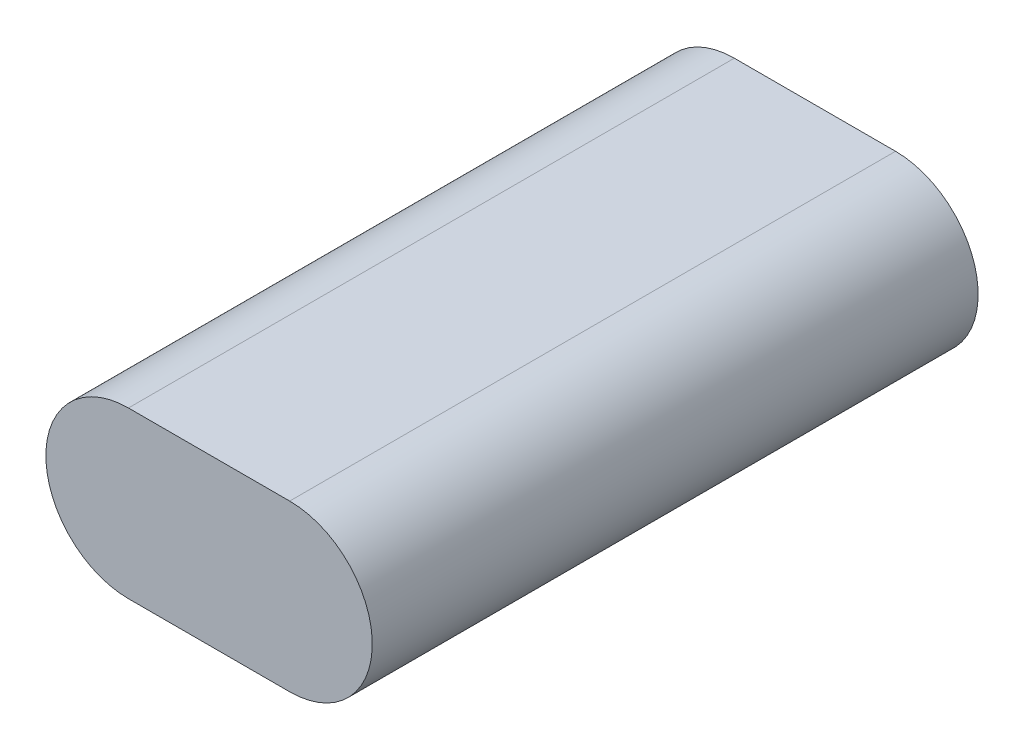
ISO-10303-21;
HEADER;
FILE_DESCRIPTION(('STEP AP214'),'2;1');
FILE_NAME('part.step','',(''),(''),'','','');
FILE_SCHEMA(('AUTOMOTIVE_DESIGN { 1 0 10303 214 1 1 1 1 }'));
ENDSEC;
DATA;
#1=APPLICATION_CONTEXT('core data for automotive mechanical design processes');
#2=APPLICATION_PROTOCOL_DEFINITION('international standard','automotive_design',2000,#1);
#3=PRODUCT_CONTEXT('',#1,'mechanical');
#4=PRODUCT('Part','Part','',(#3));
#5=PRODUCT_RELATED_PRODUCT_CATEGORY('part','',(#4));
#6=PRODUCT_DEFINITION_FORMATION('','',#4);
#7=PRODUCT_DEFINITION_CONTEXT('part definition',#1,'design');
#8=PRODUCT_DEFINITION('design','',#6,#7);
#9=PRODUCT_DEFINITION_SHAPE('','',#8);
#10=(LENGTH_UNIT() NAMED_UNIT(*) SI_UNIT(.MILLI.,.METRE.));
#11=(NAMED_UNIT(*) PLANE_ANGLE_UNIT() SI_UNIT($,.RADIAN.));
#12=(NAMED_UNIT(*) SI_UNIT($,.STERADIAN.) SOLID_ANGLE_UNIT());
#13=UNCERTAINTY_MEASURE_WITH_UNIT(LENGTH_MEASURE(1.E-05),#10,'distance_accuracy_value','');
#14=(GEOMETRIC_REPRESENTATION_CONTEXT(3) GLOBAL_UNCERTAINTY_ASSIGNED_CONTEXT((#13)) GLOBAL_UNIT_ASSIGNED_CONTEXT((#10,
#11,#12)) REPRESENTATION_CONTEXT('',''));
#15=CARTESIAN_POINT('',(0.,0.,0.));
#16=DIRECTION('',(0.,0.,1.));
#17=DIRECTION('',(1.,0.,0.));
#18=AXIS2_PLACEMENT_3D('',#15,#16,#17);
#19=CARTESIAN_POINT('',(16.3,0.,-122.5));
#20=DIRECTION('',(0.,0.,1.));
#21=DIRECTION('',(1.,0.,0.));
#22=AXIS2_PLACEMENT_3D('',#19,#20,#21);
#23=CYLINDRICAL_SURFACE('',#22,16.7);
#24=CARTESIAN_POINT('',(16.3,0.,0.));
#25=DIRECTION('',(0.,0.,1.));
#26=DIRECTION('',(-1.,0.,0.));
#27=AXIS2_PLACEMENT_3D('',#24,#25,#26);
#28=CIRCLE('',#27,16.7);
#29=CARTESIAN_POINT('',(16.3,-16.7,0.));
#30=VERTEX_POINT('',#29);
#31=CARTESIAN_POINT('',(16.3,16.7,0.));
#32=VERTEX_POINT('',#31);
#33=EDGE_CURVE('E95',#30,#32,#28,.T.);
#34=ORIENTED_EDGE('',*,*,#33,.F.);
#35=DIRECTION('',(0.,0.,1.));
#36=VECTOR('',#35,1.);
#37=CARTESIAN_POINT('',(16.3,-16.7,-122.5));
#38=LINE('',#37,#36);
#39=CARTESIAN_POINT('',(16.3,-16.7,-122.5));
#40=VERTEX_POINT('',#39);
#41=EDGE_CURVE('E11',#40,#30,#38,.T.);
#42=ORIENTED_EDGE('',*,*,#41,.F.);
#43=CARTESIAN_POINT('',(16.3,0.,-122.5));
#44=DIRECTION('',(0.,0.,1.));
#45=DIRECTION('',(-1.,0.,0.));
#46=AXIS2_PLACEMENT_3D('',#43,#44,#45);
#47=CIRCLE('',#46,16.7);
#48=CARTESIAN_POINT('',(16.3,16.7,-122.5));
#49=VERTEX_POINT('',#48);
#50=EDGE_CURVE('E89',#40,#49,#47,.T.);
#51=ORIENTED_EDGE('',*,*,#50,.T.);
#52=DIRECTION('',(0.,0.,1.));
#53=VECTOR('',#52,1.);
#54=CARTESIAN_POINT('',(16.3,16.7,-122.5));
#55=LINE('',#54,#53);
#56=EDGE_CURVE('E34',#49,#32,#55,.T.);
#57=ORIENTED_EDGE('',*,*,#56,.T.);
#58=EDGE_LOOP('',(#34,#42,#51,#57));
#59=FACE_BOUND('',#58,.T.);
#60=ADVANCED_FACE('F31',(#59),#23,.T.);
#61=CARTESIAN_POINT('',(16.3,-16.7,-122.5));
#62=DIRECTION('',(0.,-1.,0.));
#63=DIRECTION('',(0.,0.,-1.));
#64=AXIS2_PLACEMENT_3D('',#61,#62,#63);
#65=PLANE('',#64);
#66=DIRECTION('',(1.,0.,0.));
#67=VECTOR('',#66,1.);
#68=CARTESIAN_POINT('',(16.3,-16.7,0.));
#69=LINE('',#68,#67);
#70=CARTESIAN_POINT('',(-16.3,-16.7,0.));
#71=VERTEX_POINT('',#70);
#72=EDGE_CURVE('E91',#71,#30,#69,.T.);
#73=ORIENTED_EDGE('',*,*,#72,.F.);
#74=DIRECTION('',(0.,0.,1.));
#75=VECTOR('',#74,1.);
#76=CARTESIAN_POINT('',(-16.3,-16.7,-122.5));
#77=LINE('',#76,#75);
#78=CARTESIAN_POINT('',(-16.3,-16.7,-122.5));
#79=VERTEX_POINT('',#78);
#80=EDGE_CURVE('E40',#79,#71,#77,.T.);
#81=ORIENTED_EDGE('',*,*,#80,.F.);
#82=DIRECTION('',(1.,0.,0.));
#83=VECTOR('',#82,1.);
#84=CARTESIAN_POINT('',(16.3,-16.7,-122.5));
#85=LINE('',#84,#83);
#86=EDGE_CURVE('E86',#79,#40,#85,.T.);
#87=ORIENTED_EDGE('',*,*,#86,.T.);
#88=ORIENTED_EDGE('',*,*,#41,.T.);
#89=EDGE_LOOP('',(#73,#81,#87,#88));
#90=FACE_BOUND('',#89,.T.);
#91=ADVANCED_FACE('F105',(#90),#65,.T.);
#92=CARTESIAN_POINT('',(-16.3,0.,-122.5));
#93=DIRECTION('',(0.,0.,1.));
#94=DIRECTION('',(1.,0.,0.));
#95=AXIS2_PLACEMENT_3D('',#92,#93,#94);
#96=CYLINDRICAL_SURFACE('',#95,16.7);
#97=CARTESIAN_POINT('',(-16.3,0.,0.));
#98=DIRECTION('',(0.,0.,1.));
#99=DIRECTION('',(1.,0.,0.));
#100=AXIS2_PLACEMENT_3D('',#97,#98,#99);
#101=CIRCLE('',#100,16.7);
#102=CARTESIAN_POINT('',(-16.3,16.7,0.));
#103=VERTEX_POINT('',#102);
#104=EDGE_CURVE('E81',#103,#71,#101,.T.);
#105=ORIENTED_EDGE('',*,*,#104,.F.);
#106=DIRECTION('',(0.,0.,1.));
#107=VECTOR('',#106,1.);
#108=CARTESIAN_POINT('',(-16.3,16.7,-122.5));
#109=LINE('',#108,#107);
#110=CARTESIAN_POINT('',(-16.3,16.7,-122.5));
#111=VERTEX_POINT('',#110);
#112=EDGE_CURVE('E76',#111,#103,#109,.T.);
#113=ORIENTED_EDGE('',*,*,#112,.F.);
#114=CARTESIAN_POINT('',(-16.3,0.,-122.5));
#115=DIRECTION('',(0.,0.,1.));
#116=DIRECTION('',(1.,0.,0.));
#117=AXIS2_PLACEMENT_3D('',#114,#115,#116);
#118=CIRCLE('',#117,16.7);
#119=EDGE_CURVE('E79',#111,#79,#118,.T.);
#120=ORIENTED_EDGE('',*,*,#119,.T.);
#121=ORIENTED_EDGE('',*,*,#80,.T.);
#122=EDGE_LOOP('',(#105,#113,#120,#121));
#123=FACE_BOUND('',#122,.T.);
#124=ADVANCED_FACE('F78',(#123),#96,.T.);
#125=CARTESIAN_POINT('',(-16.3,16.7,-122.5));
#126=DIRECTION('',(0.,1.,0.));
#127=DIRECTION('',(0.,0.,1.));
#128=AXIS2_PLACEMENT_3D('',#125,#126,#127);
#129=PLANE('',#128);
#130=DIRECTION('',(-1.,0.,0.));
#131=VECTOR('',#130,1.);
#132=CARTESIAN_POINT('',(-16.3,16.7,0.));
#133=LINE('',#132,#131);
#134=EDGE_CURVE('E98',#32,#103,#133,.T.);
#135=ORIENTED_EDGE('',*,*,#134,.F.);
#136=ORIENTED_EDGE('',*,*,#56,.F.);
#137=DIRECTION('',(-1.,0.,0.));
#138=VECTOR('',#137,1.);
#139=CARTESIAN_POINT('',(-16.3,16.7,-122.5));
#140=LINE('',#139,#138);
#141=EDGE_CURVE('E85',#49,#111,#140,.T.);
#142=ORIENTED_EDGE('',*,*,#141,.T.);
#143=ORIENTED_EDGE('',*,*,#112,.T.);
#144=EDGE_LOOP('',(#135,#136,#142,#143));
#145=FACE_BOUND('',#144,.T.);
#146=ADVANCED_FACE('F88',(#145),#129,.T.);
#147=CARTESIAN_POINT('',(16.3,0.,-122.5));
#148=DIRECTION('',(0.,0.,-1.));
#149=DIRECTION('',(-1.,0.,0.));
#150=AXIS2_PLACEMENT_3D('',#147,#148,#149);
#151=PLANE('',#150);
#152=ORIENTED_EDGE('',*,*,#50,.F.);
#153=ORIENTED_EDGE('',*,*,#86,.F.);
#154=ORIENTED_EDGE('',*,*,#119,.F.);
#155=ORIENTED_EDGE('',*,*,#141,.F.);
#156=EDGE_LOOP('',(#152,#153,#154,#155));
#157=FACE_BOUND('',#156,.T.);
#158=ADVANCED_FACE('F84',(#157),#151,.T.);
#159=CARTESIAN_POINT('',(16.3,0.,0.));
#160=DIRECTION('',(0.,0.,-1.));
#161=DIRECTION('',(-1.,0.,0.));
#162=AXIS2_PLACEMENT_3D('',#159,#160,#161);
#163=PLANE('',#162);
#164=ORIENTED_EDGE('',*,*,#33,.T.);
#165=ORIENTED_EDGE('',*,*,#134,.T.);
#166=ORIENTED_EDGE('',*,*,#104,.T.);
#167=ORIENTED_EDGE('',*,*,#72,.T.);
#168=EDGE_LOOP('',(#164,#165,#166,#167));
#169=FACE_BOUND('',#168,.T.);
#170=ADVANCED_FACE('F104',(#169),#163,.F.);
#171=CLOSED_SHELL('',(#60,#91,#124,#146,#158,#170));
#172=MANIFOLD_SOLID_BREP('B2',#171);
#173=ADVANCED_BREP_SHAPE_REPRESENTATION('',(#18,#172),#14);
#174=SHAPE_DEFINITION_REPRESENTATION(#9,#173);
ENDSEC;
END-ISO-10303-21;
